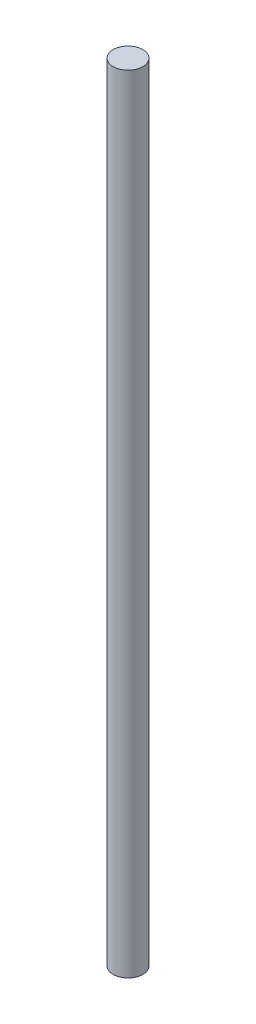
ISO-10303-21;
HEADER;
FILE_DESCRIPTION(('STEP AP214'),'2;1');
FILE_NAME('part.step','',(''),(''),'','','');
FILE_SCHEMA(('AUTOMOTIVE_DESIGN { 1 0 10303 214 1 1 1 1 }'));
ENDSEC;
DATA;
#1=APPLICATION_CONTEXT('core data for automotive mechanical design processes');
#2=APPLICATION_PROTOCOL_DEFINITION('international standard','automotive_design',2000,#1);
#3=PRODUCT_CONTEXT('',#1,'mechanical');
#4=PRODUCT('Part','Part','',(#3));
#5=PRODUCT_RELATED_PRODUCT_CATEGORY('part','',(#4));
#6=PRODUCT_DEFINITION_FORMATION('','',#4);
#7=PRODUCT_DEFINITION_CONTEXT('part definition',#1,'design');
#8=PRODUCT_DEFINITION('design','',#6,#7);
#9=PRODUCT_DEFINITION_SHAPE('','',#8);
#10=(LENGTH_UNIT() NAMED_UNIT(*) SI_UNIT(.MILLI.,.METRE.));
#11=(NAMED_UNIT(*) PLANE_ANGLE_UNIT() SI_UNIT($,.RADIAN.));
#12=(NAMED_UNIT(*) SI_UNIT($,.STERADIAN.) SOLID_ANGLE_UNIT());
#13=UNCERTAINTY_MEASURE_WITH_UNIT(LENGTH_MEASURE(1.E-05),#10,'distance_accuracy_value','');
#14=(GEOMETRIC_REPRESENTATION_CONTEXT(3) GLOBAL_UNCERTAINTY_ASSIGNED_CONTEXT((#13)) GLOBAL_UNIT_ASSIGNED_CONTEXT((#10,
#11,#12)) REPRESENTATION_CONTEXT('',''));
#15=CARTESIAN_POINT('',(0.,0.,0.));
#16=DIRECTION('',(0.,0.,1.));
#17=DIRECTION('',(1.,0.,0.));
#18=AXIS2_PLACEMENT_3D('',#15,#16,#17);
#19=CARTESIAN_POINT('',(0.,53.,0.));
#20=DIRECTION('',(0.,-1.,0.));
#21=DIRECTION('',(0.,0.,-1.));
#22=AXIS2_PLACEMENT_3D('',#19,#20,#21);
#23=CYLINDRICAL_SURFACE('',#22,1.);
#24=CARTESIAN_POINT('',(0.,53.,0.));
#25=DIRECTION('',(0.,1.,0.));
#26=DIRECTION('',(0.,0.,1.));
#27=AXIS2_PLACEMENT_3D('',#24,#25,#26);
#28=CIRCLE('',#27,1.);
#29=CARTESIAN_POINT('',(0.,53.,1.));
#30=VERTEX_POINT('',#29);
#31=EDGE_CURVE('E10',#30,#30,#28,.T.);
#32=ORIENTED_EDGE('',*,*,#31,.F.);
#33=EDGE_LOOP('',(#32));
#34=FACE_BOUND('',#33,.T.);
#35=CARTESIAN_POINT('',(0.,0.,0.));
#36=DIRECTION('',(0.,1.,0.));
#37=DIRECTION('',(0.,0.,1.));
#38=AXIS2_PLACEMENT_3D('',#35,#36,#37);
#39=CIRCLE('',#38,1.);
#40=CARTESIAN_POINT('',(0.,0.,1.));
#41=VERTEX_POINT('',#40);
#42=EDGE_CURVE('E42',#41,#41,#39,.T.);
#43=ORIENTED_EDGE('',*,*,#42,.T.);
#44=EDGE_LOOP('',(#43));
#45=FACE_BOUND('',#44,.T.);
#46=ADVANCED_FACE('F39',(#34,#45),#23,.T.);
#47=CARTESIAN_POINT('',(0.,53.,0.));
#48=DIRECTION('',(0.,1.,0.));
#49=DIRECTION('',(0.,0.,1.));
#50=AXIS2_PLACEMENT_3D('',#47,#48,#49);
#51=PLANE('',#50);
#52=ORIENTED_EDGE('',*,*,#31,.T.);
#53=EDGE_LOOP('',(#52));
#54=FACE_BOUND('',#53,.T.);
#55=ADVANCED_FACE('F54',(#54),#51,.T.);
#56=CARTESIAN_POINT('',(0.,0.,0.));
#57=DIRECTION('',(0.,1.,0.));
#58=DIRECTION('',(0.,0.,1.));
#59=AXIS2_PLACEMENT_3D('',#56,#57,#58);
#60=PLANE('',#59);
#61=ORIENTED_EDGE('',*,*,#42,.F.);
#62=EDGE_LOOP('',(#61));
#63=FACE_BOUND('',#62,.T.);
#64=ADVANCED_FACE('F52',(#63),#60,.F.);
#65=CLOSED_SHELL('',(#46,#55,#64));
#66=MANIFOLD_SOLID_BREP('B2',#65);
#67=ADVANCED_BREP_SHAPE_REPRESENTATION('',(#18,#66),#14);
#68=SHAPE_DEFINITION_REPRESENTATION(#9,#67);
ENDSEC;
END-ISO-10303-21;
